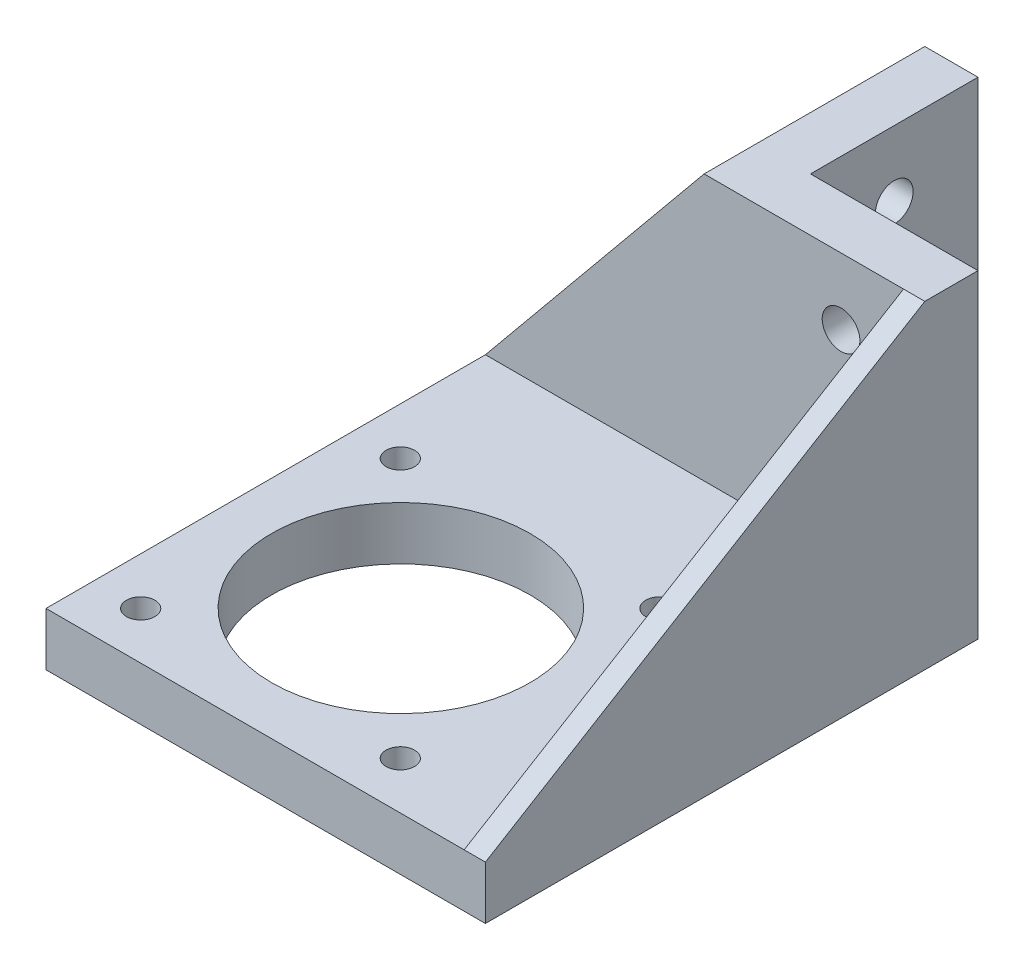
ISO-10303-21;
HEADER;
FILE_DESCRIPTION(('STEP AP214'),'2;1');
FILE_NAME('part.step','',(''),(''),'','','');
FILE_SCHEMA(('AUTOMOTIVE_DESIGN { 1 0 10303 214 1 1 1 1 }'));
ENDSEC;
DATA;
#1=APPLICATION_CONTEXT('core data for automotive mechanical design processes');
#2=APPLICATION_PROTOCOL_DEFINITION('international standard','automotive_design',2000,#1);
#3=PRODUCT_CONTEXT('',#1,'mechanical');
#4=PRODUCT('Part','Part','',(#3));
#5=PRODUCT_RELATED_PRODUCT_CATEGORY('part','',(#4));
#6=PRODUCT_DEFINITION_FORMATION('','',#4);
#7=PRODUCT_DEFINITION_CONTEXT('part definition',#1,'design');
#8=PRODUCT_DEFINITION('design','',#6,#7);
#9=PRODUCT_DEFINITION_SHAPE('','',#8);
#10=(LENGTH_UNIT() NAMED_UNIT(*) SI_UNIT(.MILLI.,.METRE.));
#11=(NAMED_UNIT(*) PLANE_ANGLE_UNIT() SI_UNIT($,.RADIAN.));
#12=(NAMED_UNIT(*) SI_UNIT($,.STERADIAN.) SOLID_ANGLE_UNIT());
#13=UNCERTAINTY_MEASURE_WITH_UNIT(LENGTH_MEASURE(1.E-05),#10,'distance_accuracy_value','');
#14=(GEOMETRIC_REPRESENTATION_CONTEXT(3) GLOBAL_UNCERTAINTY_ASSIGNED_CONTEXT((#13)) GLOBAL_UNIT_ASSIGNED_CONTEXT((#10,
#11,#12)) REPRESENTATION_CONTEXT('',''));
#15=CARTESIAN_POINT('',(0.,0.,0.));
#16=DIRECTION('',(0.,0.,1.));
#17=DIRECTION('',(1.,0.,0.));
#18=AXIS2_PLACEMENT_3D('',#15,#16,#17);
#19=CARTESIAN_POINT('',(0.,6.35,0.));
#20=DIRECTION('',(0.,-1.,0.));
#21=DIRECTION('',(0.,0.,-1.));
#22=AXIS2_PLACEMENT_3D('',#19,#20,#21);
#23=PLANE('',#22);
#24=CARTESIAN_POINT('',(4.19,6.35,22.16));
#25=DIRECTION('',(0.,1.,0.));
#26=DIRECTION('',(0.,0.,1.));
#27=AXIS2_PLACEMENT_3D('',#24,#25,#26);
#28=CIRCLE('',#27,1.7);
#29=CARTESIAN_POINT('',(4.19,6.35,23.86));
#30=VERTEX_POINT('',#29);
#31=EDGE_CURVE('E275',#30,#30,#28,.T.);
#32=ORIENTED_EDGE('',*,*,#31,.F.);
#33=EDGE_LOOP('',(#32));
#34=FACE_BOUND('',#33,.T.);
#35=CARTESIAN_POINT('',(-11.3143213333498,6.35,37.5919934283761));
#36=DIRECTION('',(0.,1.,0.));
#37=DIRECTION('',(0.,0.,1.));
#38=AXIS2_PLACEMENT_3D('',#35,#36,#37);
#39=CIRCLE('',#38,15.4319934283761);
#40=CARTESIAN_POINT('',(-11.3143213333498,6.35,53.0239868567523));
#41=VERTEX_POINT('',#40);
#42=EDGE_CURVE('E266',#41,#41,#39,.T.);
#43=ORIENTED_EDGE('',*,*,#42,.F.);
#44=EDGE_LOOP('',(#43));
#45=FACE_BOUND('',#44,.T.);
#46=CARTESIAN_POINT('',(4.19,6.35,53.16));
#47=DIRECTION('',(0.,1.,0.));
#48=DIRECTION('',(0.,0.,1.));
#49=AXIS2_PLACEMENT_3D('',#46,#47,#48);
#50=CIRCLE('',#49,1.7);
#51=CARTESIAN_POINT('',(4.19,6.35,54.86));
#52=VERTEX_POINT('',#51);
#53=EDGE_CURVE('E260',#52,#52,#50,.T.);
#54=ORIENTED_EDGE('',*,*,#53,.F.);
#55=EDGE_LOOP('',(#54));
#56=FACE_BOUND('',#55,.T.);
#57=CARTESIAN_POINT('',(-26.81,6.35,22.16));
#58=DIRECTION('',(0.,1.,0.));
#59=DIRECTION('',(0.,0.,1.));
#60=AXIS2_PLACEMENT_3D('',#57,#58,#59);
#61=CIRCLE('',#60,1.7);
#62=CARTESIAN_POINT('',(-26.81,6.35,23.86));
#63=VERTEX_POINT('',#62);
#64=EDGE_CURVE('E279',#63,#63,#61,.T.);
#65=ORIENTED_EDGE('',*,*,#64,.F.);
#66=EDGE_LOOP('',(#65));
#67=FACE_BOUND('',#66,.T.);
#68=CARTESIAN_POINT('',(-26.81,6.35,53.16));
#69=DIRECTION('',(0.,1.,0.));
#70=DIRECTION('',(0.,0.,1.));
#71=AXIS2_PLACEMENT_3D('',#68,#69,#70);
#72=CIRCLE('',#71,1.7);
#73=CARTESIAN_POINT('',(-26.81,6.35,54.86));
#74=VERTEX_POINT('',#73);
#75=EDGE_CURVE('E272',#74,#74,#72,.T.);
#76=ORIENTED_EDGE('',*,*,#75,.F.);
#77=EDGE_LOOP('',(#76));
#78=FACE_BOUND('',#77,.T.);
#79=DIRECTION('',(-1.,0.,0.));
#80=VECTOR('',#79,1.);
#81=CARTESIAN_POINT('',(0.,6.35,6.35));
#82=LINE('',#81,#80);
#83=CARTESIAN_POINT('',(17.46,6.35000000000002,6.35));
#84=VERTEX_POINT('',#83);
#85=CARTESIAN_POINT('',(-32.46,6.35,6.35));
#86=VERTEX_POINT('',#85);
#87=EDGE_CURVE('E182',#84,#86,#82,.T.);
#88=ORIENTED_EDGE('',*,*,#87,.T.);
#89=DIRECTION('',(0.,0.,1.));
#90=VECTOR('',#89,1.);
#91=CARTESIAN_POINT('',(-32.46,6.35,6.34999999999999));
#92=LINE('',#91,#90);
#93=CARTESIAN_POINT('',(-32.46,6.35,58.81));
#94=VERTEX_POINT('',#93);
#95=EDGE_CURVE('E185',#86,#94,#92,.T.);
#96=ORIENTED_EDGE('',*,*,#95,.T.);
#97=DIRECTION('',(1.,0.,0.));
#98=VECTOR('',#97,1.);
#99=CARTESIAN_POINT('',(0.,6.35,58.81));
#100=LINE('',#99,#98);
#101=CARTESIAN_POINT('',(17.46,6.35,58.81));
#102=VERTEX_POINT('',#101);
#103=EDGE_CURVE('E191',#94,#102,#100,.T.);
#104=ORIENTED_EDGE('',*,*,#103,.T.);
#105=DIRECTION('',(0.,0.,-1.));
#106=VECTOR('',#105,1.);
#107=CARTESIAN_POINT('',(17.46,6.35,58.81));
#108=LINE('',#107,#106);
#109=EDGE_CURVE('E187',#102,#84,#108,.T.);
#110=ORIENTED_EDGE('',*,*,#109,.T.);
#111=EDGE_LOOP('',(#88,#96,#104,#110));
#112=FACE_BOUND('',#111,.T.);
#113=ADVANCED_FACE('F89',(#34,#45,#56,#67,#78,#112),#23,.F.);
#114=CARTESIAN_POINT('',(-32.46,6.35,-17.46));
#115=VERTEX_POINT('',#114);
#116=CARTESIAN_POINT('',(-32.46,6.35,3.81));
#117=VERTEX_POINT('',#116);
#118=EDGE_CURVE('E202',#115,#117,#92,.T.);
#119=ORIENTED_EDGE('',*,*,#118,.T.);
#120=DIRECTION('',(1.,0.,0.));
#121=VECTOR('',#120,1.);
#122=CARTESIAN_POINT('',(-32.46,6.35,3.81));
#123=LINE('',#122,#121);
#124=CARTESIAN_POINT('',(-6.35,6.35,3.81));
#125=VERTEX_POINT('',#124);
#126=EDGE_CURVE('E105',#117,#125,#123,.T.);
#127=ORIENTED_EDGE('',*,*,#126,.T.);
#128=DIRECTION('',(0.,0.,-1.));
#129=VECTOR('',#128,1.);
#130=CARTESIAN_POINT('',(-6.35,6.35,0.));
#131=LINE('',#130,#129);
#132=CARTESIAN_POINT('',(-6.35,6.35,-17.46));
#133=VERTEX_POINT('',#132);
#134=EDGE_CURVE('E192',#125,#133,#131,.T.);
#135=ORIENTED_EDGE('',*,*,#134,.T.);
#136=DIRECTION('',(-1.,0.,0.));
#137=VECTOR('',#136,1.);
#138=CARTESIAN_POINT('',(-32.46,6.35,-17.46));
#139=LINE('',#138,#137);
#140=EDGE_CURVE('E234',#133,#115,#139,.T.);
#141=ORIENTED_EDGE('',*,*,#140,.T.);
#142=EDGE_LOOP('',(#119,#127,#135,#141));
#143=FACE_BOUND('',#142,.T.);
#144=ADVANCED_FACE('F407',(#143),#23,.F.);
#145=CARTESIAN_POINT('',(-6.35,38.1,0.));
#146=DIRECTION('',(1.,0.,0.));
#147=DIRECTION('',(0.,0.,-1.));
#148=AXIS2_PLACEMENT_3D('',#145,#146,#147);
#149=PLANE('',#148);
#150=CARTESIAN_POINT('',(-6.35,30.1625,-10.));
#151=DIRECTION('',(-1.,0.,0.));
#152=DIRECTION('',(0.,0.,1.));
#153=AXIS2_PLACEMENT_3D('',#150,#151,#152);
#154=CIRCLE('',#153,2.24999999999999);
#155=CARTESIAN_POINT('',(-6.35,30.1625,-7.75000000000001));
#156=VERTEX_POINT('',#155);
#157=EDGE_CURVE('E371',#156,#156,#154,.T.);
#158=ORIENTED_EDGE('',*,*,#157,.F.);
#159=EDGE_LOOP('',(#158));
#160=FACE_BOUND('',#159,.T.);
#161=CARTESIAN_POINT('',(-6.35,14.2875,-10.));
#162=DIRECTION('',(-1.,0.,0.));
#163=DIRECTION('',(0.,0.,1.));
#164=AXIS2_PLACEMENT_3D('',#161,#162,#163);
#165=CIRCLE('',#164,2.24999999999999);
#166=CARTESIAN_POINT('',(-6.35,14.2875,-7.75000000000001));
#167=VERTEX_POINT('',#166);
#168=EDGE_CURVE('E225',#167,#167,#165,.T.);
#169=ORIENTED_EDGE('',*,*,#168,.F.);
#170=EDGE_LOOP('',(#169));
#171=FACE_BOUND('',#170,.T.);
#172=ORIENTED_EDGE('',*,*,#134,.F.);
#173=DIRECTION('',(0.,1.,0.));
#174=VECTOR('',#173,1.);
#175=CARTESIAN_POINT('',(-6.35,6.35,3.81));
#176=LINE('',#175,#174);
#177=CARTESIAN_POINT('',(-6.35,38.1,3.81));
#178=VERTEX_POINT('',#177);
#179=EDGE_CURVE('E112',#125,#178,#176,.T.);
#180=ORIENTED_EDGE('',*,*,#179,.T.);
#181=DIRECTION('',(0.,0.,1.));
#182=VECTOR('',#181,1.);
#183=CARTESIAN_POINT('',(-6.35,38.1,0.));
#184=LINE('',#183,#182);
#185=CARTESIAN_POINT('',(-6.35,38.1,-17.46));
#186=VERTEX_POINT('',#185);
#187=EDGE_CURVE('E312',#186,#178,#184,.T.);
#188=ORIENTED_EDGE('',*,*,#187,.F.);
#189=DIRECTION('',(0.,-1.,0.));
#190=VECTOR('',#189,1.);
#191=CARTESIAN_POINT('',(-6.35,6.35000000000002,-17.46));
#192=LINE('',#191,#190);
#193=EDGE_CURVE('E231',#186,#133,#192,.T.);
#194=ORIENTED_EDGE('',*,*,#193,.T.);
#195=EDGE_LOOP('',(#172,#180,#188,#194));
#196=FACE_BOUND('',#195,.T.);
#197=ADVANCED_FACE('F362',(#160,#171,#196),#149,.F.);
#198=CARTESIAN_POINT('',(0.,38.1,6.35));
#199=DIRECTION('',(0.,0.,-1.));
#200=DIRECTION('',(-1.,0.,0.));
#201=AXIS2_PLACEMENT_3D('',#198,#199,#200);
#202=PLANE('',#201);
#203=CARTESIAN_POINT('',(10.,30.1625,6.35));
#204=DIRECTION('',(0.,0.,1.));
#205=DIRECTION('',(1.,0.,0.));
#206=AXIS2_PLACEMENT_3D('',#203,#204,#205);
#207=CIRCLE('',#206,2.24999999999999);
#208=CARTESIAN_POINT('',(12.25,30.1625,6.35));
#209=VERTEX_POINT('',#208);
#210=EDGE_CURVE('E380',#209,#209,#207,.T.);
#211=ORIENTED_EDGE('',*,*,#210,.F.);
#212=EDGE_LOOP('',(#211));
#213=FACE_BOUND('',#212,.T.);
#214=CARTESIAN_POINT('',(10.,14.2875,6.35));
#215=DIRECTION('',(0.,0.,1.));
#216=DIRECTION('',(1.,0.,0.));
#217=AXIS2_PLACEMENT_3D('',#214,#215,#216);
#218=CIRCLE('',#217,2.24999999999999);
#219=CARTESIAN_POINT('',(12.25,14.2875,6.35));
#220=VERTEX_POINT('',#219);
#221=EDGE_CURVE('E377',#220,#220,#218,.T.);
#222=ORIENTED_EDGE('',*,*,#221,.F.);
#223=EDGE_LOOP('',(#222));
#224=FACE_BOUND('',#223,.T.);
#225=DIRECTION('',(0.,1.,0.));
#226=VECTOR('',#225,1.);
#227=CARTESIAN_POINT('',(17.46,6.35000000000002,6.35));
#228=LINE('',#227,#226);
#229=CARTESIAN_POINT('',(17.46,38.1,6.35));
#230=VERTEX_POINT('',#229);
#231=EDGE_CURVE('E247',#84,#230,#228,.T.);
#232=ORIENTED_EDGE('',*,*,#231,.T.);
#233=DIRECTION('',(1.,0.,0.));
#234=VECTOR('',#233,1.);
#235=CARTESIAN_POINT('',(0.,38.1,6.35));
#236=LINE('',#235,#234);
#237=CARTESIAN_POINT('',(-6.35,38.1,6.35));
#238=VERTEX_POINT('',#237);
#239=EDGE_CURVE('E220',#238,#230,#236,.T.);
#240=ORIENTED_EDGE('',*,*,#239,.F.);
#241=DIRECTION('',(-0.635169905397873,-0.772372443369685,0.));
#242=VECTOR('',#241,1.);
#243=CARTESIAN_POINT('',(-6.35,38.1,6.35));
#244=LINE('',#243,#242);
#245=EDGE_CURVE('E211',#238,#86,#244,.T.);
#246=ORIENTED_EDGE('',*,*,#245,.T.);
#247=ORIENTED_EDGE('',*,*,#87,.F.);
#248=EDGE_LOOP('',(#232,#240,#246,#247));
#249=FACE_BOUND('',#248,.T.);
#250=ADVANCED_FACE('F218',(#213,#224,#249),#202,.F.);
#251=CARTESIAN_POINT('',(20.,38.1,0.));
#252=DIRECTION('',(1.,0.,0.));
#253=DIRECTION('',(0.,0.,-1.));
#254=AXIS2_PLACEMENT_3D('',#251,#252,#253);
#255=PLANE('',#254);
#256=DIRECTION('',(0.,0.,1.));
#257=VECTOR('',#256,1.);
#258=CARTESIAN_POINT('',(20.,0.,0.));
#259=LINE('',#258,#257);
#260=CARTESIAN_POINT('',(20.,0.,0.));
#261=VERTEX_POINT('',#260);
#262=CARTESIAN_POINT('',(20.,0.,58.81));
#263=VERTEX_POINT('',#262);
#264=EDGE_CURVE('E296',#261,#263,#259,.T.);
#265=ORIENTED_EDGE('',*,*,#264,.F.);
#266=DIRECTION('',(0.,-1.,0.));
#267=VECTOR('',#266,1.);
#268=CARTESIAN_POINT('',(20.,38.1,0.));
#269=LINE('',#268,#267);
#270=CARTESIAN_POINT('',(20.,38.1,0.));
#271=VERTEX_POINT('',#270);
#272=EDGE_CURVE('E12',#271,#261,#269,.T.);
#273=ORIENTED_EDGE('',*,*,#272,.F.);
#274=DIRECTION('',(0.,0.,1.));
#275=VECTOR('',#274,1.);
#276=CARTESIAN_POINT('',(20.,38.1,0.));
#277=LINE('',#276,#275);
#278=CARTESIAN_POINT('',(20.,38.1,6.35));
#279=VERTEX_POINT('',#278);
#280=EDGE_CURVE('E301',#271,#279,#277,.T.);
#281=ORIENTED_EDGE('',*,*,#280,.T.);
#282=DIRECTION('',(0.,-0.517777551873074,0.855515287283826));
#283=VECTOR('',#282,1.);
#284=CARTESIAN_POINT('',(20.,38.1,6.35));
#285=LINE('',#284,#283);
#286=CARTESIAN_POINT('',(20.,6.35,58.81));
#287=VERTEX_POINT('',#286);
#288=EDGE_CURVE('E245',#279,#287,#285,.T.);
#289=ORIENTED_EDGE('',*,*,#288,.T.);
#290=DIRECTION('',(0.,-1.,0.));
#291=VECTOR('',#290,1.);
#292=CARTESIAN_POINT('',(20.,6.35,58.81));
#293=LINE('',#292,#291);
#294=EDGE_CURVE('E292',#287,#263,#293,.T.);
#295=ORIENTED_EDGE('',*,*,#294,.T.);
#296=EDGE_LOOP('',(#265,#273,#281,#289,#295));
#297=FACE_BOUND('',#296,.T.);
#298=ADVANCED_FACE('F91',(#297),#255,.T.);
#299=CARTESIAN_POINT('',(0.,38.1,0.));
#300=DIRECTION('',(0.,0.,-1.));
#301=DIRECTION('',(-1.,0.,0.));
#302=AXIS2_PLACEMENT_3D('',#299,#300,#301);
#303=PLANE('',#302);
#304=CARTESIAN_POINT('',(10.,30.1625,0.));
#305=DIRECTION('',(0.,0.,-1.));
#306=DIRECTION('',(-1.,0.,0.));
#307=AXIS2_PLACEMENT_3D('',#304,#305,#306);
#308=CIRCLE('',#307,2.24999999999999);
#309=CARTESIAN_POINT('',(7.75000000000001,30.1625,0.));
#310=VERTEX_POINT('',#309);
#311=EDGE_CURVE('E93',#310,#310,#308,.T.);
#312=ORIENTED_EDGE('',*,*,#311,.F.);
#313=EDGE_LOOP('',(#312));
#314=FACE_BOUND('',#313,.T.);
#315=CARTESIAN_POINT('',(10.,14.2875,0.));
#316=DIRECTION('',(0.,0.,-1.));
#317=DIRECTION('',(-1.,0.,0.));
#318=AXIS2_PLACEMENT_3D('',#315,#316,#317);
#319=CIRCLE('',#318,2.24999999999999);
#320=CARTESIAN_POINT('',(7.75000000000001,14.2875,0.));
#321=VERTEX_POINT('',#320);
#322=EDGE_CURVE('E374',#321,#321,#319,.T.);
#323=ORIENTED_EDGE('',*,*,#322,.F.);
#324=EDGE_LOOP('',(#323));
#325=FACE_BOUND('',#324,.T.);
#326=DIRECTION('',(1.,0.,0.));
#327=VECTOR('',#326,1.);
#328=CARTESIAN_POINT('',(0.,0.,0.));
#329=LINE('',#328,#327);
#330=CARTESIAN_POINT('',(0.,0.,0.));
#331=VERTEX_POINT('',#330);
#332=EDGE_CURVE('E319',#331,#261,#329,.T.);
#333=ORIENTED_EDGE('',*,*,#332,.F.);
#334=DIRECTION('',(0.,-1.,0.));
#335=VECTOR('',#334,1.);
#336=CARTESIAN_POINT('',(0.,38.1,0.));
#337=LINE('',#336,#335);
#338=CARTESIAN_POINT('',(0.,38.1,0.));
#339=VERTEX_POINT('',#338);
#340=EDGE_CURVE('E98',#339,#331,#337,.T.);
#341=ORIENTED_EDGE('',*,*,#340,.F.);
#342=DIRECTION('',(1.,0.,0.));
#343=VECTOR('',#342,1.);
#344=CARTESIAN_POINT('',(0.,38.1,0.));
#345=LINE('',#344,#343);
#346=EDGE_CURVE('E304',#339,#271,#345,.T.);
#347=ORIENTED_EDGE('',*,*,#346,.T.);
#348=ORIENTED_EDGE('',*,*,#272,.T.);
#349=EDGE_LOOP('',(#333,#341,#347,#348));
#350=FACE_BOUND('',#349,.T.);
#351=ADVANCED_FACE('F339',(#314,#325,#350),#303,.T.);
#352=CARTESIAN_POINT('',(0.,38.1,0.));
#353=DIRECTION('',(-1.,0.,0.));
#354=DIRECTION('',(0.,0.,1.));
#355=AXIS2_PLACEMENT_3D('',#352,#353,#354);
#356=PLANE('',#355);
#357=CARTESIAN_POINT('',(0.,30.1625,-10.));
#358=DIRECTION('',(-1.,0.,0.));
#359=DIRECTION('',(0.,0.,1.));
#360=AXIS2_PLACEMENT_3D('',#357,#358,#359);
#361=CIRCLE('',#360,2.24999999999999);
#362=CARTESIAN_POINT('',(0.,30.1625,-7.75000000000001));
#363=VERTEX_POINT('',#362);
#364=EDGE_CURVE('E368',#363,#363,#361,.T.);
#365=ORIENTED_EDGE('',*,*,#364,.T.);
#366=EDGE_LOOP('',(#365));
#367=FACE_BOUND('',#366,.T.);
#368=CARTESIAN_POINT('',(0.,14.2875,-10.));
#369=DIRECTION('',(-1.,0.,0.));
#370=DIRECTION('',(0.,0.,1.));
#371=AXIS2_PLACEMENT_3D('',#368,#369,#370);
#372=CIRCLE('',#371,2.24999999999999);
#373=CARTESIAN_POINT('',(0.,14.2875,-7.75000000000001));
#374=VERTEX_POINT('',#373);
#375=EDGE_CURVE('E221',#374,#374,#372,.T.);
#376=ORIENTED_EDGE('',*,*,#375,.T.);
#377=EDGE_LOOP('',(#376));
#378=FACE_BOUND('',#377,.T.);
#379=DIRECTION('',(0.,0.,-1.));
#380=VECTOR('',#379,1.);
#381=CARTESIAN_POINT('',(0.,0.,0.));
#382=LINE('',#381,#380);
#383=CARTESIAN_POINT('',(0.,0.,-20.));
#384=VERTEX_POINT('',#383);
#385=EDGE_CURVE('E322',#331,#384,#382,.T.);
#386=ORIENTED_EDGE('',*,*,#385,.T.);
#387=DIRECTION('',(0.,-1.,0.));
#388=VECTOR('',#387,1.);
#389=CARTESIAN_POINT('',(0.,38.1,-20.));
#390=LINE('',#389,#388);
#391=CARTESIAN_POINT('',(0.,38.1,-20.));
#392=VERTEX_POINT('',#391);
#393=EDGE_CURVE('E317',#392,#384,#390,.T.);
#394=ORIENTED_EDGE('',*,*,#393,.F.);
#395=DIRECTION('',(0.,0.,-1.));
#396=VECTOR('',#395,1.);
#397=CARTESIAN_POINT('',(0.,38.1,0.));
#398=LINE('',#397,#396);
#399=EDGE_CURVE('E308',#339,#392,#398,.T.);
#400=ORIENTED_EDGE('',*,*,#399,.F.);
#401=ORIENTED_EDGE('',*,*,#340,.T.);
#402=EDGE_LOOP('',(#386,#394,#400,#401));
#403=FACE_BOUND('',#402,.T.);
#404=ADVANCED_FACE('F330',(#367,#378,#403),#356,.F.);
#405=CARTESIAN_POINT('',(0.,38.1,-20.));
#406=DIRECTION('',(0.,0.,1.));
#407=DIRECTION('',(1.,0.,0.));
#408=AXIS2_PLACEMENT_3D('',#405,#406,#407);
#409=PLANE('',#408);
#410=DIRECTION('',(-1.,0.,0.));
#411=VECTOR('',#410,1.);
#412=CARTESIAN_POINT('',(0.,0.,-20.));
#413=LINE('',#412,#411);
#414=CARTESIAN_POINT('',(-32.46,0.,-20.));
#415=VERTEX_POINT('',#414);
#416=EDGE_CURVE('E305',#384,#415,#413,.T.);
#417=ORIENTED_EDGE('',*,*,#416,.T.);
#418=DIRECTION('',(0.,1.,0.));
#419=VECTOR('',#418,1.);
#420=CARTESIAN_POINT('',(-32.46,-28.2408941076588,-20.));
#421=LINE('',#420,#419);
#422=CARTESIAN_POINT('',(-32.46,6.35,-20.));
#423=VERTEX_POINT('',#422);
#424=EDGE_CURVE('E240',#415,#423,#421,.T.);
#425=ORIENTED_EDGE('',*,*,#424,.T.);
#426=DIRECTION('',(0.635169905397873,0.772372443369685,0.));
#427=VECTOR('',#426,1.);
#428=CARTESIAN_POINT('',(-6.35,38.1,-20.));
#429=LINE('',#428,#427);
#430=CARTESIAN_POINT('',(-6.35,38.1,-20.));
#431=VERTEX_POINT('',#430);
#432=EDGE_CURVE('E214',#423,#431,#429,.T.);
#433=ORIENTED_EDGE('',*,*,#432,.T.);
#434=DIRECTION('',(-1.,0.,0.));
#435=VECTOR('',#434,1.);
#436=CARTESIAN_POINT('',(0.,38.1,-20.));
#437=LINE('',#436,#435);
#438=EDGE_CURVE('E310',#392,#431,#437,.T.);
#439=ORIENTED_EDGE('',*,*,#438,.F.);
#440=ORIENTED_EDGE('',*,*,#393,.T.);
#441=EDGE_LOOP('',(#417,#425,#433,#439,#440));
#442=FACE_BOUND('',#441,.T.);
#443=ADVANCED_FACE('F350',(#442),#409,.F.);
#444=CARTESIAN_POINT('',(0.,38.1,0.));
#445=DIRECTION('',(0.,1.,0.));
#446=DIRECTION('',(0.,0.,1.));
#447=AXIS2_PLACEMENT_3D('',#444,#445,#446);
#448=PLANE('',#447);
#449=ORIENTED_EDGE('',*,*,#280,.F.);
#450=ORIENTED_EDGE('',*,*,#346,.F.);
#451=ORIENTED_EDGE('',*,*,#399,.T.);
#452=ORIENTED_EDGE('',*,*,#438,.T.);
#453=EDGE_CURVE('E313',#431,#186,#184,.T.);
#454=ORIENTED_EDGE('',*,*,#453,.T.);
#455=ORIENTED_EDGE('',*,*,#187,.T.);
#456=DIRECTION('',(0.,0.,1.));
#457=VECTOR('',#456,1.);
#458=CARTESIAN_POINT('',(-6.35,38.1,3.81));
#459=LINE('',#458,#457);
#460=EDGE_CURVE('E215',#178,#238,#459,.T.);
#461=ORIENTED_EDGE('',*,*,#460,.T.);
#462=ORIENTED_EDGE('',*,*,#239,.T.);
#463=DIRECTION('',(1.,0.,0.));
#464=VECTOR('',#463,1.);
#465=CARTESIAN_POINT('',(17.46,38.1,6.35));
#466=LINE('',#465,#464);
#467=EDGE_CURVE('E252',#230,#279,#466,.T.);
#468=ORIENTED_EDGE('',*,*,#467,.T.);
#469=EDGE_LOOP('',(#449,#450,#451,#452,#454,#455,#461,#462,#468));
#470=FACE_BOUND('',#469,.T.);
#471=ADVANCED_FACE('F358',(#470),#448,.T.);
#472=CARTESIAN_POINT('',(0.,0.,0.));
#473=DIRECTION('',(0.,1.,0.));
#474=DIRECTION('',(0.,0.,1.));
#475=AXIS2_PLACEMENT_3D('',#472,#473,#474);
#476=PLANE('',#475);
#477=CARTESIAN_POINT('',(-26.81,0.,53.16));
#478=DIRECTION('',(0.,1.,0.));
#479=DIRECTION('',(0.,0.,1.));
#480=AXIS2_PLACEMENT_3D('',#477,#478,#479);
#481=CIRCLE('',#480,1.7);
#482=CARTESIAN_POINT('',(-26.81,0.,54.86));
#483=VERTEX_POINT('',#482);
#484=EDGE_CURVE('E276',#483,#483,#481,.T.);
#485=ORIENTED_EDGE('',*,*,#484,.T.);
#486=EDGE_LOOP('',(#485));
#487=FACE_BOUND('',#486,.T.);
#488=CARTESIAN_POINT('',(-26.81,0.,22.16));
#489=DIRECTION('',(0.,1.,0.));
#490=DIRECTION('',(0.,0.,1.));
#491=AXIS2_PLACEMENT_3D('',#488,#489,#490);
#492=CIRCLE('',#491,1.7);
#493=CARTESIAN_POINT('',(-26.81,0.,23.86));
#494=VERTEX_POINT('',#493);
#495=EDGE_CURVE('E269',#494,#494,#492,.T.);
#496=ORIENTED_EDGE('',*,*,#495,.T.);
#497=EDGE_LOOP('',(#496));
#498=FACE_BOUND('',#497,.T.);
#499=CARTESIAN_POINT('',(4.19,0.,53.16));
#500=DIRECTION('',(0.,1.,0.));
#501=DIRECTION('',(0.,0.,1.));
#502=AXIS2_PLACEMENT_3D('',#499,#500,#501);
#503=CIRCLE('',#502,1.7);
#504=CARTESIAN_POINT('',(4.19,0.,54.86));
#505=VERTEX_POINT('',#504);
#506=EDGE_CURVE('E257',#505,#505,#503,.T.);
#507=ORIENTED_EDGE('',*,*,#506,.T.);
#508=EDGE_LOOP('',(#507));
#509=FACE_BOUND('',#508,.T.);
#510=CARTESIAN_POINT('',(-11.3143213333498,0.,37.5919934283761));
#511=DIRECTION('',(0.,1.,0.));
#512=DIRECTION('',(0.,0.,1.));
#513=AXIS2_PLACEMENT_3D('',#510,#511,#512);
#514=CIRCLE('',#513,15.4319934283761);
#515=CARTESIAN_POINT('',(-11.3143213333498,0.,53.0239868567523));
#516=VERTEX_POINT('',#515);
#517=EDGE_CURVE('E263',#516,#516,#514,.T.);
#518=ORIENTED_EDGE('',*,*,#517,.T.);
#519=EDGE_LOOP('',(#518));
#520=FACE_BOUND('',#519,.T.);
#521=CARTESIAN_POINT('',(4.19,0.,22.16));
#522=DIRECTION('',(0.,1.,0.));
#523=DIRECTION('',(0.,0.,1.));
#524=AXIS2_PLACEMENT_3D('',#521,#522,#523);
#525=CIRCLE('',#524,1.7);
#526=CARTESIAN_POINT('',(4.19,0.,23.86));
#527=VERTEX_POINT('',#526);
#528=EDGE_CURVE('E284',#527,#527,#525,.T.);
#529=ORIENTED_EDGE('',*,*,#528,.T.);
#530=EDGE_LOOP('',(#529));
#531=FACE_BOUND('',#530,.T.);
#532=ORIENTED_EDGE('',*,*,#264,.T.);
#533=DIRECTION('',(1.,0.,0.));
#534=VECTOR('',#533,1.);
#535=CARTESIAN_POINT('',(0.,0.,58.81));
#536=LINE('',#535,#534);
#537=CARTESIAN_POINT('',(-32.46,0.,58.81));
#538=VERTEX_POINT('',#537);
#539=EDGE_CURVE('E289',#538,#263,#536,.T.);
#540=ORIENTED_EDGE('',*,*,#539,.F.);
#541=DIRECTION('',(0.,0.,1.));
#542=VECTOR('',#541,1.);
#543=CARTESIAN_POINT('',(-32.46,0.,6.34999999999999));
#544=LINE('',#543,#542);
#545=EDGE_CURVE('E203',#415,#538,#544,.T.);
#546=ORIENTED_EDGE('',*,*,#545,.F.);
#547=ORIENTED_EDGE('',*,*,#416,.F.);
#548=ORIENTED_EDGE('',*,*,#385,.F.);
#549=ORIENTED_EDGE('',*,*,#332,.T.);
#550=EDGE_LOOP('',(#532,#540,#546,#547,#548,#549));
#551=FACE_BOUND('',#550,.T.);
#552=ADVANCED_FACE('F337',(#487,#498,#509,#520,#531,#551),#476,.F.);
#553=CARTESIAN_POINT('',(0.,6.35,58.81));
#554=DIRECTION('',(0.,0.,-1.));
#555=DIRECTION('',(-1.,0.,0.));
#556=AXIS2_PLACEMENT_3D('',#553,#554,#555);
#557=PLANE('',#556);
#558=ORIENTED_EDGE('',*,*,#539,.T.);
#559=ORIENTED_EDGE('',*,*,#294,.F.);
#560=DIRECTION('',(1.,0.,0.));
#561=VECTOR('',#560,1.);
#562=CARTESIAN_POINT('',(17.46,6.35,58.81));
#563=LINE('',#562,#561);
#564=EDGE_CURVE('E254',#102,#287,#563,.T.);
#565=ORIENTED_EDGE('',*,*,#564,.F.);
#566=ORIENTED_EDGE('',*,*,#103,.F.);
#567=DIRECTION('',(0.,-1.,0.));
#568=VECTOR('',#567,1.);
#569=CARTESIAN_POINT('',(-32.46,6.35,58.81));
#570=LINE('',#569,#568);
#571=EDGE_CURVE('E201',#94,#538,#570,.T.);
#572=ORIENTED_EDGE('',*,*,#571,.T.);
#573=EDGE_LOOP('',(#558,#559,#565,#566,#572));
#574=FACE_BOUND('',#573,.T.);
#575=ADVANCED_FACE('F346',(#574),#557,.F.);
#576=CARTESIAN_POINT('',(-32.46,6.35,6.34999999999999));
#577=DIRECTION('',(1.,0.,0.));
#578=DIRECTION('',(0.,0.,-1.));
#579=AXIS2_PLACEMENT_3D('',#576,#577,#578);
#580=PLANE('',#579);
#581=ORIENTED_EDGE('',*,*,#545,.T.);
#582=ORIENTED_EDGE('',*,*,#571,.F.);
#583=ORIENTED_EDGE('',*,*,#95,.F.);
#584=DIRECTION('',(0.,0.,1.));
#585=VECTOR('',#584,1.);
#586=CARTESIAN_POINT('',(-32.46,6.35,3.81));
#587=LINE('',#586,#585);
#588=EDGE_CURVE('E199',#117,#86,#587,.T.);
#589=ORIENTED_EDGE('',*,*,#588,.F.);
#590=ORIENTED_EDGE('',*,*,#118,.F.);
#591=EDGE_CURVE('E205',#423,#115,#92,.T.);
#592=ORIENTED_EDGE('',*,*,#591,.F.);
#593=ORIENTED_EDGE('',*,*,#424,.F.);
#594=EDGE_LOOP('',(#581,#582,#583,#589,#590,#592,#593));
#595=FACE_BOUND('',#594,.T.);
#596=ADVANCED_FACE('F198',(#595),#580,.F.);
#597=CARTESIAN_POINT('',(4.19,0.,22.16));
#598=DIRECTION('',(0.,1.,0.));
#599=DIRECTION('',(0.,0.,1.));
#600=AXIS2_PLACEMENT_3D('',#597,#598,#599);
#601=CYLINDRICAL_SURFACE('',#600,1.7);
#602=ORIENTED_EDGE('',*,*,#528,.F.);
#603=EDGE_LOOP('',(#602));
#604=FACE_BOUND('',#603,.T.);
#605=ORIENTED_EDGE('',*,*,#31,.T.);
#606=EDGE_LOOP('',(#605));
#607=FACE_BOUND('',#606,.T.);
#608=ADVANCED_FACE('F421',(#604,#607),#601,.F.);
#609=CARTESIAN_POINT('',(-11.3143213333498,0.,37.5919934283761));
#610=DIRECTION('',(0.,1.,0.));
#611=DIRECTION('',(0.,0.,1.));
#612=AXIS2_PLACEMENT_3D('',#609,#610,#611);
#613=CYLINDRICAL_SURFACE('',#612,15.4319934283761);
#614=ORIENTED_EDGE('',*,*,#517,.F.);
#615=EDGE_LOOP('',(#614));
#616=FACE_BOUND('',#615,.T.);
#617=ORIENTED_EDGE('',*,*,#42,.T.);
#618=EDGE_LOOP('',(#617));
#619=FACE_BOUND('',#618,.T.);
#620=ADVANCED_FACE('F444',(#616,#619),#613,.F.);
#621=CARTESIAN_POINT('',(4.19,0.,53.16));
#622=DIRECTION('',(0.,1.,0.));
#623=DIRECTION('',(0.,0.,1.));
#624=AXIS2_PLACEMENT_3D('',#621,#622,#623);
#625=CYLINDRICAL_SURFACE('',#624,1.7);
#626=ORIENTED_EDGE('',*,*,#506,.F.);
#627=EDGE_LOOP('',(#626));
#628=FACE_BOUND('',#627,.T.);
#629=ORIENTED_EDGE('',*,*,#53,.T.);
#630=EDGE_LOOP('',(#629));
#631=FACE_BOUND('',#630,.T.);
#632=ADVANCED_FACE('F448',(#628,#631),#625,.F.);
#633=CARTESIAN_POINT('',(-26.81,0.,22.16));
#634=DIRECTION('',(0.,1.,0.));
#635=DIRECTION('',(0.,0.,1.));
#636=AXIS2_PLACEMENT_3D('',#633,#634,#635);
#637=CYLINDRICAL_SURFACE('',#636,1.7);
#638=ORIENTED_EDGE('',*,*,#495,.F.);
#639=EDGE_LOOP('',(#638));
#640=FACE_BOUND('',#639,.T.);
#641=ORIENTED_EDGE('',*,*,#64,.T.);
#642=EDGE_LOOP('',(#641));
#643=FACE_BOUND('',#642,.T.);
#644=ADVANCED_FACE('F454',(#640,#643),#637,.F.);
#645=CARTESIAN_POINT('',(-26.81,0.,53.16));
#646=DIRECTION('',(0.,1.,0.));
#647=DIRECTION('',(0.,0.,1.));
#648=AXIS2_PLACEMENT_3D('',#645,#646,#647);
#649=CYLINDRICAL_SURFACE('',#648,1.7);
#650=ORIENTED_EDGE('',*,*,#484,.F.);
#651=EDGE_LOOP('',(#650));
#652=FACE_BOUND('',#651,.T.);
#653=ORIENTED_EDGE('',*,*,#75,.T.);
#654=EDGE_LOOP('',(#653));
#655=FACE_BOUND('',#654,.T.);
#656=ADVANCED_FACE('F460',(#652,#655),#649,.F.);
#657=CARTESIAN_POINT('',(17.46,38.1,6.35));
#658=DIRECTION('',(0.,0.855515287283825,0.517777551873074));
#659=DIRECTION('',(0.,-0.517777551873074,0.855515287283825));
#660=AXIS2_PLACEMENT_3D('',#657,#658,#659);
#661=PLANE('',#660);
#662=ORIENTED_EDGE('',*,*,#288,.F.);
#663=ORIENTED_EDGE('',*,*,#467,.F.);
#664=DIRECTION('',(0.,-0.517777551873074,0.855515287283826));
#665=VECTOR('',#664,1.);
#666=CARTESIAN_POINT('',(17.46,38.1,6.35));
#667=LINE('',#666,#665);
#668=EDGE_CURVE('E249',#230,#102,#667,.T.);
#669=ORIENTED_EDGE('',*,*,#668,.T.);
#670=ORIENTED_EDGE('',*,*,#564,.T.);
#671=EDGE_LOOP('',(#662,#663,#669,#670));
#672=FACE_BOUND('',#671,.T.);
#673=ADVANCED_FACE('F462',(#672),#661,.T.);
#674=CARTESIAN_POINT('',(17.46,0.,0.));
#675=DIRECTION('',(1.,0.,0.));
#676=DIRECTION('',(0.,0.,-1.));
#677=AXIS2_PLACEMENT_3D('',#674,#675,#676);
#678=PLANE('',#677);
#679=ORIENTED_EDGE('',*,*,#109,.F.);
#680=ORIENTED_EDGE('',*,*,#668,.F.);
#681=ORIENTED_EDGE('',*,*,#231,.F.);
#682=EDGE_LOOP('',(#679,#680,#681));
#683=FACE_BOUND('',#682,.T.);
#684=ADVANCED_FACE('F487',(#683),#678,.F.);
#685=CARTESIAN_POINT('',(-6.35,38.1,-17.46));
#686=DIRECTION('',(-0.772372443369685,0.635169905397873,0.));
#687=DIRECTION('',(-0.635169905397873,-0.772372443369685,0.));
#688=AXIS2_PLACEMENT_3D('',#685,#686,#687);
#689=PLANE('',#688);
#690=ORIENTED_EDGE('',*,*,#432,.F.);
#691=ORIENTED_EDGE('',*,*,#591,.T.);
#692=DIRECTION('',(0.635169905397873,0.772372443369685,0.));
#693=VECTOR('',#692,1.);
#694=CARTESIAN_POINT('',(-6.35,38.1,-17.46));
#695=LINE('',#694,#693);
#696=EDGE_CURVE('E237',#115,#186,#695,.T.);
#697=ORIENTED_EDGE('',*,*,#696,.T.);
#698=ORIENTED_EDGE('',*,*,#453,.F.);
#699=EDGE_LOOP('',(#690,#691,#697,#698));
#700=FACE_BOUND('',#699,.T.);
#701=ADVANCED_FACE('F354',(#700),#689,.T.);
#702=CARTESIAN_POINT('',(0.,0.,-17.46));
#703=DIRECTION('',(0.,0.,-1.));
#704=DIRECTION('',(-1.,0.,0.));
#705=AXIS2_PLACEMENT_3D('',#702,#703,#704);
#706=PLANE('',#705);
#707=ORIENTED_EDGE('',*,*,#193,.F.);
#708=ORIENTED_EDGE('',*,*,#696,.F.);
#709=ORIENTED_EDGE('',*,*,#140,.F.);
#710=EDGE_LOOP('',(#707,#708,#709));
#711=FACE_BOUND('',#710,.T.);
#712=ADVANCED_FACE('F361',(#711),#706,.F.);
#713=CARTESIAN_POINT('',(-6.35,38.1,3.81));
#714=DIRECTION('',(-0.772372443369685,0.635169905397873,0.));
#715=DIRECTION('',(-0.635169905397873,-0.772372443369685,0.));
#716=AXIS2_PLACEMENT_3D('',#713,#714,#715);
#717=PLANE('',#716);
#718=ORIENTED_EDGE('',*,*,#245,.F.);
#719=ORIENTED_EDGE('',*,*,#460,.F.);
#720=DIRECTION('',(-0.635169905397873,-0.772372443369685,0.));
#721=VECTOR('',#720,1.);
#722=CARTESIAN_POINT('',(-6.35,38.1,3.81));
#723=LINE('',#722,#721);
#724=EDGE_CURVE('E213',#178,#117,#723,.T.);
#725=ORIENTED_EDGE('',*,*,#724,.T.);
#726=ORIENTED_EDGE('',*,*,#588,.T.);
#727=EDGE_LOOP('',(#718,#719,#725,#726));
#728=FACE_BOUND('',#727,.T.);
#729=ADVANCED_FACE('F209',(#728),#717,.T.);
#730=CARTESIAN_POINT('',(0.,0.,3.81));
#731=DIRECTION('',(0.,0.,-1.));
#732=DIRECTION('',(-1.,0.,0.));
#733=AXIS2_PLACEMENT_3D('',#730,#731,#732);
#734=PLANE('',#733);
#735=ORIENTED_EDGE('',*,*,#179,.F.);
#736=ORIENTED_EDGE('',*,*,#126,.F.);
#737=ORIENTED_EDGE('',*,*,#724,.F.);
#738=EDGE_LOOP('',(#735,#736,#737));
#739=FACE_BOUND('',#738,.T.);
#740=ADVANCED_FACE('F364',(#739),#734,.T.);
#741=CARTESIAN_POINT('',(-6.35,14.2875,-10.));
#742=DIRECTION('',(-1.,0.,0.));
#743=DIRECTION('',(0.,0.,1.));
#744=AXIS2_PLACEMENT_3D('',#741,#742,#743);
#745=CYLINDRICAL_SURFACE('',#744,2.24999999999999);
#746=ORIENTED_EDGE('',*,*,#168,.T.);
#747=EDGE_LOOP('',(#746));
#748=FACE_BOUND('',#747,.T.);
#749=ORIENTED_EDGE('',*,*,#375,.F.);
#750=EDGE_LOOP('',(#749));
#751=FACE_BOUND('',#750,.T.);
#752=ADVANCED_FACE('F522',(#748,#751),#745,.F.);
#753=CARTESIAN_POINT('',(-6.35,30.1625,-10.));
#754=DIRECTION('',(-1.,0.,0.));
#755=DIRECTION('',(0.,0.,1.));
#756=AXIS2_PLACEMENT_3D('',#753,#754,#755);
#757=CYLINDRICAL_SURFACE('',#756,2.24999999999999);
#758=ORIENTED_EDGE('',*,*,#157,.T.);
#759=EDGE_LOOP('',(#758));
#760=FACE_BOUND('',#759,.T.);
#761=ORIENTED_EDGE('',*,*,#364,.F.);
#762=EDGE_LOOP('',(#761));
#763=FACE_BOUND('',#762,.T.);
#764=ADVANCED_FACE('F396',(#760,#763),#757,.F.);
#765=CARTESIAN_POINT('',(10.,14.2875,6.35));
#766=DIRECTION('',(0.,0.,1.));
#767=DIRECTION('',(1.,0.,0.));
#768=AXIS2_PLACEMENT_3D('',#765,#766,#767);
#769=CYLINDRICAL_SURFACE('',#768,2.24999999999999);
#770=ORIENTED_EDGE('',*,*,#322,.T.);
#771=EDGE_LOOP('',(#770));
#772=FACE_BOUND('',#771,.T.);
#773=ORIENTED_EDGE('',*,*,#221,.T.);
#774=EDGE_LOOP('',(#773));
#775=FACE_BOUND('',#774,.T.);
#776=ADVANCED_FACE('F393',(#772,#775),#769,.F.);
#777=CARTESIAN_POINT('',(10.,30.1625,6.35));
#778=DIRECTION('',(0.,0.,1.));
#779=DIRECTION('',(1.,0.,0.));
#780=AXIS2_PLACEMENT_3D('',#777,#778,#779);
#781=CYLINDRICAL_SURFACE('',#780,2.24999999999999);
#782=ORIENTED_EDGE('',*,*,#311,.T.);
#783=EDGE_LOOP('',(#782));
#784=FACE_BOUND('',#783,.T.);
#785=ORIENTED_EDGE('',*,*,#210,.T.);
#786=EDGE_LOOP('',(#785));
#787=FACE_BOUND('',#786,.T.);
#788=ADVANCED_FACE('F387',(#784,#787),#781,.F.);
#789=CLOSED_SHELL('',(#113,#144,#197,#250,#298,#351,#404,#443,#471,#552,#575,#596,#608,#620,
#632,#644,#656,#673,#684,#701,#712,#729,#740,#752,#764,#776,#788));
#790=MANIFOLD_SOLID_BREP('B2',#789);
#791=ADVANCED_BREP_SHAPE_REPRESENTATION('',(#18,#790),#14);
#792=SHAPE_DEFINITION_REPRESENTATION(#9,#791);
ENDSEC;
END-ISO-10303-21;
